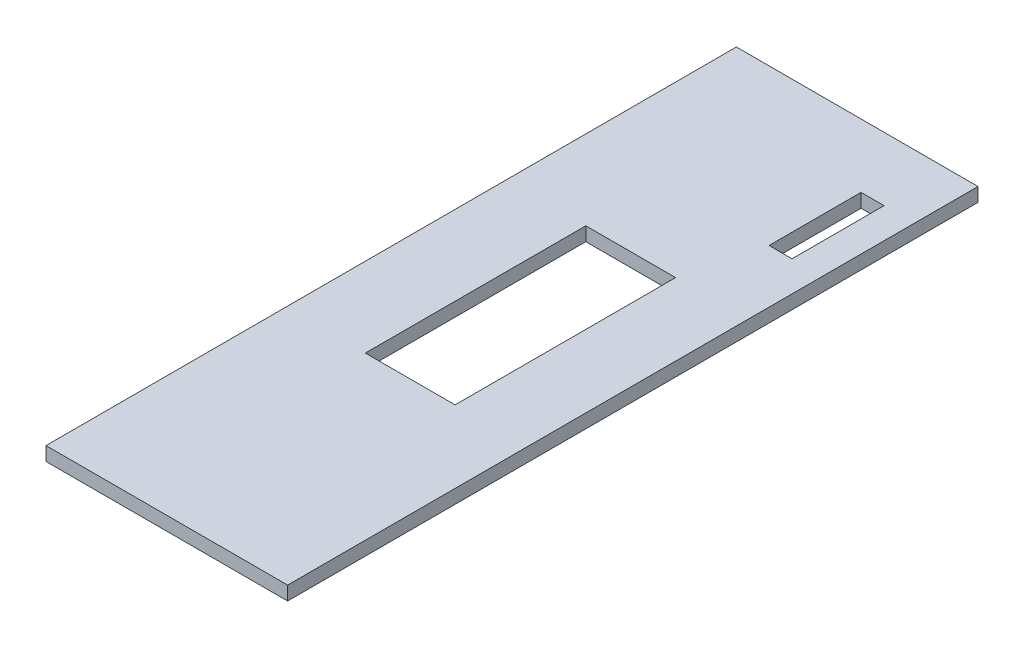
ISO-10303-21;
HEADER;
FILE_DESCRIPTION(('STEP AP214'),'2;1');
FILE_NAME('part.step','',(''),(''),'','','');
FILE_SCHEMA(('AUTOMOTIVE_DESIGN { 1 0 10303 214 1 1 1 1 }'));
ENDSEC;
DATA;
#1=APPLICATION_CONTEXT('core data for automotive mechanical design processes');
#2=APPLICATION_PROTOCOL_DEFINITION('international standard','automotive_design',2000,#1);
#3=PRODUCT_CONTEXT('',#1,'mechanical');
#4=PRODUCT('Part','Part','',(#3));
#5=PRODUCT_RELATED_PRODUCT_CATEGORY('part','',(#4));
#6=PRODUCT_DEFINITION_FORMATION('','',#4);
#7=PRODUCT_DEFINITION_CONTEXT('part definition',#1,'design');
#8=PRODUCT_DEFINITION('design','',#6,#7);
#9=PRODUCT_DEFINITION_SHAPE('','',#8);
#10=(LENGTH_UNIT() NAMED_UNIT(*) SI_UNIT(.MILLI.,.METRE.));
#11=(NAMED_UNIT(*) PLANE_ANGLE_UNIT() SI_UNIT($,.RADIAN.));
#12=(NAMED_UNIT(*) SI_UNIT($,.STERADIAN.) SOLID_ANGLE_UNIT());
#13=UNCERTAINTY_MEASURE_WITH_UNIT(LENGTH_MEASURE(1.E-05),#10,'distance_accuracy_value','');
#14=(GEOMETRIC_REPRESENTATION_CONTEXT(3) GLOBAL_UNCERTAINTY_ASSIGNED_CONTEXT((#13)) GLOBAL_UNIT_ASSIGNED_CONTEXT((#10,
#11,#12)) REPRESENTATION_CONTEXT('',''));
#15=CARTESIAN_POINT('',(0.,0.,0.));
#16=DIRECTION('',(0.,0.,1.));
#17=DIRECTION('',(1.,0.,0.));
#18=AXIS2_PLACEMENT_3D('',#15,#16,#17);
#19=CARTESIAN_POINT('',(-30.1902748414376,8.76849894291755,300.));
#20=DIRECTION('',(1.,0.,0.));
#21=DIRECTION('',(0.,0.,-1.));
#22=AXIS2_PLACEMENT_3D('',#19,#20,#21);
#23=PLANE('',#22);
#24=DIRECTION('',(0.,-1.,0.));
#25=VECTOR('',#24,1.);
#26=CARTESIAN_POINT('',(-30.1902748414376,8.76849894291755,0.));
#27=LINE('',#26,#25);
#28=CARTESIAN_POINT('',(-30.1902748414376,8.76849894291755,0.));
#29=VERTEX_POINT('',#28);
#30=CARTESIAN_POINT('',(-30.1902748414376,2.76849894291755,0.));
#31=VERTEX_POINT('',#30);
#32=EDGE_CURVE('E190',#29,#31,#27,.T.);
#33=ORIENTED_EDGE('',*,*,#32,.T.);
#34=DIRECTION('',(0.,0.,-1.));
#35=VECTOR('',#34,1.);
#36=CARTESIAN_POINT('',(-30.1902748414376,2.76849894291755,300.));
#37=LINE('',#36,#35);
#38=CARTESIAN_POINT('',(-30.1902748414376,2.76849894291755,300.));
#39=VERTEX_POINT('',#38);
#40=EDGE_CURVE('E11',#39,#31,#37,.T.);
#41=ORIENTED_EDGE('',*,*,#40,.F.);
#42=DIRECTION('',(0.,-1.,0.));
#43=VECTOR('',#42,1.);
#44=CARTESIAN_POINT('',(-30.1902748414376,8.76849894291755,300.));
#45=LINE('',#44,#43);
#46=CARTESIAN_POINT('',(-30.1902748414376,8.76849894291755,300.));
#47=VERTEX_POINT('',#46);
#48=EDGE_CURVE('E191',#47,#39,#45,.T.);
#49=ORIENTED_EDGE('',*,*,#48,.F.);
#50=DIRECTION('',(0.,0.,-1.));
#51=VECTOR('',#50,1.);
#52=CARTESIAN_POINT('',(-30.1902748414376,8.76849894291755,300.));
#53=LINE('',#52,#51);
#54=EDGE_CURVE('E201',#47,#29,#53,.T.);
#55=ORIENTED_EDGE('',*,*,#54,.T.);
#56=EDGE_LOOP('',(#33,#41,#49,#55));
#57=FACE_BOUND('',#56,.T.);
#58=ADVANCED_FACE('F33',(#57),#23,.F.);
#59=CARTESIAN_POINT('',(-30.1902748414376,2.76849894291755,300.));
#60=DIRECTION('',(0.,1.,0.));
#61=DIRECTION('',(0.,0.,1.));
#62=AXIS2_PLACEMENT_3D('',#59,#60,#61);
#63=PLANE('',#62);
#64=DIRECTION('',(-1.,0.,0.));
#65=VECTOR('',#64,1.);
#66=CARTESIAN_POINT('',(-30.1902748414376,2.76849894291755,100.));
#67=LINE('',#66,#65);
#68=CARTESIAN_POINT('',(43.3797251585624,2.76849894291755,100.));
#69=VERTEX_POINT('',#68);
#70=CARTESIAN_POINT('',(4.37972515856238,2.76849894291755,100.));
#71=VERTEX_POINT('',#70);
#72=EDGE_CURVE('E152',#69,#71,#67,.T.);
#73=ORIENTED_EDGE('',*,*,#72,.T.);
#74=DIRECTION('',(0.,0.,1.));
#75=VECTOR('',#74,1.);
#76=CARTESIAN_POINT('',(4.37972515856241,2.76849894291755,300.));
#77=LINE('',#76,#75);
#78=CARTESIAN_POINT('',(4.37972515856239,2.76849894291755,195.8));
#79=VERTEX_POINT('',#78);
#80=EDGE_CURVE('E155',#71,#79,#77,.T.);
#81=ORIENTED_EDGE('',*,*,#80,.T.);
#82=DIRECTION('',(1.,0.,0.));
#83=VECTOR('',#82,1.);
#84=CARTESIAN_POINT('',(-30.1902748414376,2.76849894291755,195.8));
#85=LINE('',#84,#83);
#86=CARTESIAN_POINT('',(43.3797251585624,2.76849894291755,195.8));
#87=VERTEX_POINT('',#86);
#88=EDGE_CURVE('E147',#79,#87,#85,.T.);
#89=ORIENTED_EDGE('',*,*,#88,.T.);
#90=DIRECTION('',(0.,0.,-1.));
#91=VECTOR('',#90,1.);
#92=CARTESIAN_POINT('',(43.3797251585624,2.76849894291755,300.));
#93=LINE('',#92,#91);
#94=EDGE_CURVE('E127',#87,#69,#93,.T.);
#95=ORIENTED_EDGE('',*,*,#94,.T.);
#96=EDGE_LOOP('',(#73,#81,#89,#95));
#97=FACE_BOUND('',#96,.T.);
#98=DIRECTION('',(-1.,0.,0.));
#99=VECTOR('',#98,1.);
#100=CARTESIAN_POINT('',(-30.1902748414376,2.76849894291755,27.62));
#101=LINE('',#100,#99);
#102=CARTESIAN_POINT('',(61.6097251585624,2.76849894291755,27.62));
#103=VERTEX_POINT('',#102);
#104=CARTESIAN_POINT('',(51.6097251585624,2.76849894291755,27.62));
#105=VERTEX_POINT('',#104);
#106=EDGE_CURVE('E184',#103,#105,#101,.T.);
#107=ORIENTED_EDGE('',*,*,#106,.T.);
#108=DIRECTION('',(0.,0.,1.));
#109=VECTOR('',#108,1.);
#110=CARTESIAN_POINT('',(51.6097251585624,2.76849894291755,300.));
#111=LINE('',#110,#109);
#112=CARTESIAN_POINT('',(51.6097251585624,2.76849894291755,67.62));
#113=VERTEX_POINT('',#112);
#114=EDGE_CURVE('E187',#105,#113,#111,.T.);
#115=ORIENTED_EDGE('',*,*,#114,.T.);
#116=DIRECTION('',(1.,0.,0.));
#117=VECTOR('',#116,1.);
#118=CARTESIAN_POINT('',(-30.1902748414376,2.76849894291755,67.62));
#119=LINE('',#118,#117);
#120=CARTESIAN_POINT('',(61.6097251585624,2.76849894291755,67.62));
#121=VERTEX_POINT('',#120);
#122=EDGE_CURVE('E172',#113,#121,#119,.T.);
#123=ORIENTED_EDGE('',*,*,#122,.T.);
#124=DIRECTION('',(0.,0.,-1.));
#125=VECTOR('',#124,1.);
#126=CARTESIAN_POINT('',(61.6097251585624,2.76849894291755,300.));
#127=LINE('',#126,#125);
#128=EDGE_CURVE('E181',#121,#103,#127,.T.);
#129=ORIENTED_EDGE('',*,*,#128,.T.);
#130=EDGE_LOOP('',(#107,#115,#123,#129));
#131=FACE_BOUND('',#130,.T.);
#132=DIRECTION('',(1.,0.,0.));
#133=VECTOR('',#132,1.);
#134=CARTESIAN_POINT('',(-30.1902748414376,2.76849894291755,0.));
#135=LINE('',#134,#133);
#136=CARTESIAN_POINT('',(74.8097251585624,2.76849894291755,0.));
#137=VERTEX_POINT('',#136);
#138=EDGE_CURVE('E204',#31,#137,#135,.T.);
#139=ORIENTED_EDGE('',*,*,#138,.T.);
#140=DIRECTION('',(0.,0.,-1.));
#141=VECTOR('',#140,1.);
#142=CARTESIAN_POINT('',(74.8097251585624,2.76849894291755,300.));
#143=LINE('',#142,#141);
#144=CARTESIAN_POINT('',(74.8097251585624,2.76849894291755,300.));
#145=VERTEX_POINT('',#144);
#146=EDGE_CURVE('E40',#145,#137,#143,.T.);
#147=ORIENTED_EDGE('',*,*,#146,.F.);
#148=DIRECTION('',(1.,0.,0.));
#149=VECTOR('',#148,1.);
#150=CARTESIAN_POINT('',(-30.1902748414376,2.76849894291755,300.));
#151=LINE('',#150,#149);
#152=EDGE_CURVE('E194',#39,#145,#151,.T.);
#153=ORIENTED_EDGE('',*,*,#152,.F.);
#154=ORIENTED_EDGE('',*,*,#40,.T.);
#155=EDGE_LOOP('',(#139,#147,#153,#154));
#156=FACE_BOUND('',#155,.T.);
#157=ADVANCED_FACE('F233',(#97,#131,#156),#63,.F.);
#158=CARTESIAN_POINT('',(74.8097251585624,8.76849894291755,300.));
#159=DIRECTION('',(-1.,0.,0.));
#160=DIRECTION('',(0.,0.,1.));
#161=AXIS2_PLACEMENT_3D('',#158,#159,#160);
#162=PLANE('',#161);
#163=DIRECTION('',(0.,1.,0.));
#164=VECTOR('',#163,1.);
#165=CARTESIAN_POINT('',(74.8097251585624,8.76849894291755,0.));
#166=LINE('',#165,#164);
#167=CARTESIAN_POINT('',(74.8097251585624,8.76849894291755,0.));
#168=VERTEX_POINT('',#167);
#169=EDGE_CURVE('E206',#137,#168,#166,.T.);
#170=ORIENTED_EDGE('',*,*,#169,.T.);
#171=DIRECTION('',(0.,0.,-1.));
#172=VECTOR('',#171,1.);
#173=CARTESIAN_POINT('',(74.8097251585624,8.76849894291755,300.));
#174=LINE('',#173,#172);
#175=CARTESIAN_POINT('',(74.8097251585624,8.76849894291755,300.));
#176=VERTEX_POINT('',#175);
#177=EDGE_CURVE('E211',#176,#168,#174,.T.);
#178=ORIENTED_EDGE('',*,*,#177,.F.);
#179=DIRECTION('',(0.,1.,0.));
#180=VECTOR('',#179,1.);
#181=CARTESIAN_POINT('',(74.8097251585624,8.76849894291755,300.));
#182=LINE('',#181,#180);
#183=EDGE_CURVE('E197',#145,#176,#182,.T.);
#184=ORIENTED_EDGE('',*,*,#183,.F.);
#185=ORIENTED_EDGE('',*,*,#146,.T.);
#186=EDGE_LOOP('',(#170,#178,#184,#185));
#187=FACE_BOUND('',#186,.T.);
#188=ADVANCED_FACE('F218',(#187),#162,.F.);
#189=CARTESIAN_POINT('',(-30.1902748414376,8.76849894291755,300.));
#190=DIRECTION('',(0.,-1.,0.));
#191=DIRECTION('',(0.,0.,-1.));
#192=AXIS2_PLACEMENT_3D('',#189,#190,#191);
#193=PLANE('',#192);
#194=DIRECTION('',(1.,0.,0.));
#195=VECTOR('',#194,1.);
#196=CARTESIAN_POINT('',(4.37972515856239,8.76849894291755,195.8));
#197=LINE('',#196,#195);
#198=CARTESIAN_POINT('',(4.37972515856239,8.76849894291755,195.8));
#199=VERTEX_POINT('',#198);
#200=CARTESIAN_POINT('',(43.3797251585624,8.76849894291755,195.8));
#201=VERTEX_POINT('',#200);
#202=EDGE_CURVE('E133',#199,#201,#197,.T.);
#203=ORIENTED_EDGE('',*,*,#202,.F.);
#204=DIRECTION('',(0.,0.,1.));
#205=VECTOR('',#204,1.);
#206=CARTESIAN_POINT('',(4.37972515856238,8.76849894291755,100.));
#207=LINE('',#206,#205);
#208=CARTESIAN_POINT('',(4.37972515856238,8.76849894291755,100.));
#209=VERTEX_POINT('',#208);
#210=EDGE_CURVE('E55',#209,#199,#207,.T.);
#211=ORIENTED_EDGE('',*,*,#210,.F.);
#212=DIRECTION('',(-1.,0.,0.));
#213=VECTOR('',#212,1.);
#214=CARTESIAN_POINT('',(4.37972515856238,8.76849894291755,100.));
#215=LINE('',#214,#213);
#216=CARTESIAN_POINT('',(43.3797251585624,8.76849894291755,100.));
#217=VERTEX_POINT('',#216);
#218=EDGE_CURVE('E140',#217,#209,#215,.T.);
#219=ORIENTED_EDGE('',*,*,#218,.F.);
#220=DIRECTION('',(0.,0.,-1.));
#221=VECTOR('',#220,1.);
#222=CARTESIAN_POINT('',(43.3797251585624,8.76849894291755,100.));
#223=LINE('',#222,#221);
#224=EDGE_CURVE('E124',#201,#217,#223,.T.);
#225=ORIENTED_EDGE('',*,*,#224,.F.);
#226=EDGE_LOOP('',(#203,#211,#219,#225));
#227=FACE_BOUND('',#226,.T.);
#228=DIRECTION('',(1.,0.,0.));
#229=VECTOR('',#228,1.);
#230=CARTESIAN_POINT('',(51.6097251585624,8.76849894291755,67.62));
#231=LINE('',#230,#229);
#232=CARTESIAN_POINT('',(51.6097251585624,8.76849894291755,67.62));
#233=VERTEX_POINT('',#232);
#234=CARTESIAN_POINT('',(61.6097251585624,8.76849894291755,67.62));
#235=VERTEX_POINT('',#234);
#236=EDGE_CURVE('E160',#233,#235,#231,.T.);
#237=ORIENTED_EDGE('',*,*,#236,.F.);
#238=DIRECTION('',(0.,0.,1.));
#239=VECTOR('',#238,1.);
#240=CARTESIAN_POINT('',(51.6097251585624,8.76849894291755,27.62));
#241=LINE('',#240,#239);
#242=CARTESIAN_POINT('',(51.6097251585624,8.76849894291755,27.62));
#243=VERTEX_POINT('',#242);
#244=EDGE_CURVE('E158',#243,#233,#241,.T.);
#245=ORIENTED_EDGE('',*,*,#244,.F.);
#246=DIRECTION('',(-1.,0.,0.));
#247=VECTOR('',#246,1.);
#248=CARTESIAN_POINT('',(51.6097251585624,8.76849894291755,27.62));
#249=LINE('',#248,#247);
#250=CARTESIAN_POINT('',(61.6097251585624,8.76849894291755,27.62));
#251=VERTEX_POINT('',#250);
#252=EDGE_CURVE('E166',#251,#243,#249,.T.);
#253=ORIENTED_EDGE('',*,*,#252,.F.);
#254=DIRECTION('',(0.,0.,-1.));
#255=VECTOR('',#254,1.);
#256=CARTESIAN_POINT('',(61.6097251585624,8.76849894291755,27.62));
#257=LINE('',#256,#255);
#258=EDGE_CURVE('E163',#235,#251,#257,.T.);
#259=ORIENTED_EDGE('',*,*,#258,.F.);
#260=EDGE_LOOP('',(#237,#245,#253,#259));
#261=FACE_BOUND('',#260,.T.);
#262=DIRECTION('',(-1.,0.,0.));
#263=VECTOR('',#262,1.);
#264=CARTESIAN_POINT('',(-30.1902748414376,8.76849894291755,0.));
#265=LINE('',#264,#263);
#266=EDGE_CURVE('E195',#168,#29,#265,.T.);
#267=ORIENTED_EDGE('',*,*,#266,.T.);
#268=ORIENTED_EDGE('',*,*,#54,.F.);
#269=DIRECTION('',(-1.,0.,0.));
#270=VECTOR('',#269,1.);
#271=CARTESIAN_POINT('',(-30.1902748414376,8.76849894291755,300.));
#272=LINE('',#271,#270);
#273=EDGE_CURVE('E199',#176,#47,#272,.T.);
#274=ORIENTED_EDGE('',*,*,#273,.F.);
#275=ORIENTED_EDGE('',*,*,#177,.T.);
#276=EDGE_LOOP('',(#267,#268,#274,#275));
#277=FACE_BOUND('',#276,.T.);
#278=ADVANCED_FACE('F137',(#227,#261,#277),#193,.F.);
#279=CARTESIAN_POINT('',(0.,0.,300.));
#280=DIRECTION('',(0.,0.,1.));
#281=DIRECTION('',(1.,0.,0.));
#282=AXIS2_PLACEMENT_3D('',#279,#280,#281);
#283=PLANE('',#282);
#284=ORIENTED_EDGE('',*,*,#48,.T.);
#285=ORIENTED_EDGE('',*,*,#152,.T.);
#286=ORIENTED_EDGE('',*,*,#183,.T.);
#287=ORIENTED_EDGE('',*,*,#273,.T.);
#288=EDGE_LOOP('',(#284,#285,#286,#287));
#289=FACE_BOUND('',#288,.T.);
#290=ADVANCED_FACE('F232',(#289),#283,.T.);
#291=CARTESIAN_POINT('',(0.,0.,0.));
#292=DIRECTION('',(0.,0.,1.));
#293=DIRECTION('',(1.,0.,0.));
#294=AXIS2_PLACEMENT_3D('',#291,#292,#293);
#295=PLANE('',#294);
#296=ORIENTED_EDGE('',*,*,#32,.F.);
#297=ORIENTED_EDGE('',*,*,#266,.F.);
#298=ORIENTED_EDGE('',*,*,#169,.F.);
#299=ORIENTED_EDGE('',*,*,#138,.F.);
#300=EDGE_LOOP('',(#296,#297,#298,#299));
#301=FACE_BOUND('',#300,.T.);
#302=ADVANCED_FACE('F224',(#301),#295,.F.);
#303=CARTESIAN_POINT('',(51.6097251585624,-1.23150105708245,27.62));
#304=DIRECTION('',(-1.,0.,0.));
#305=DIRECTION('',(0.,0.,1.));
#306=AXIS2_PLACEMENT_3D('',#303,#304,#305);
#307=PLANE('',#306);
#308=DIRECTION('',(0.,1.,0.));
#309=VECTOR('',#308,1.);
#310=CARTESIAN_POINT('',(51.6097251585624,-1.23150105708245,27.62));
#311=LINE('',#310,#309);
#312=EDGE_CURVE('E170',#105,#243,#311,.T.);
#313=ORIENTED_EDGE('',*,*,#312,.T.);
#314=ORIENTED_EDGE('',*,*,#244,.T.);
#315=DIRECTION('',(0.,1.,0.));
#316=VECTOR('',#315,1.);
#317=CARTESIAN_POINT('',(51.6097251585624,-1.23150105708245,67.62));
#318=LINE('',#317,#316);
#319=EDGE_CURVE('E169',#113,#233,#318,.T.);
#320=ORIENTED_EDGE('',*,*,#319,.F.);
#321=ORIENTED_EDGE('',*,*,#114,.F.);
#322=EDGE_LOOP('',(#313,#314,#320,#321));
#323=FACE_BOUND('',#322,.T.);
#324=ADVANCED_FACE('F247',(#323),#307,.F.);
#325=CARTESIAN_POINT('',(51.6097251585624,-1.23150105708245,27.62));
#326=DIRECTION('',(0.,0.,-1.));
#327=DIRECTION('',(-1.,0.,0.));
#328=AXIS2_PLACEMENT_3D('',#325,#326,#327);
#329=PLANE('',#328);
#330=DIRECTION('',(0.,1.,0.));
#331=VECTOR('',#330,1.);
#332=CARTESIAN_POINT('',(61.6097251585624,-1.23150105708245,27.62));
#333=LINE('',#332,#331);
#334=EDGE_CURVE('E173',#103,#251,#333,.T.);
#335=ORIENTED_EDGE('',*,*,#334,.T.);
#336=ORIENTED_EDGE('',*,*,#252,.T.);
#337=ORIENTED_EDGE('',*,*,#312,.F.);
#338=ORIENTED_EDGE('',*,*,#106,.F.);
#339=EDGE_LOOP('',(#335,#336,#337,#338));
#340=FACE_BOUND('',#339,.T.);
#341=ADVANCED_FACE('F252',(#340),#329,.F.);
#342=CARTESIAN_POINT('',(61.6097251585624,-1.23150105708245,27.62));
#343=DIRECTION('',(1.,0.,0.));
#344=DIRECTION('',(0.,0.,-1.));
#345=AXIS2_PLACEMENT_3D('',#342,#343,#344);
#346=PLANE('',#345);
#347=DIRECTION('',(0.,1.,0.));
#348=VECTOR('',#347,1.);
#349=CARTESIAN_POINT('',(61.6097251585624,-1.23150105708245,67.62));
#350=LINE('',#349,#348);
#351=EDGE_CURVE('E175',#121,#235,#350,.T.);
#352=ORIENTED_EDGE('',*,*,#351,.T.);
#353=ORIENTED_EDGE('',*,*,#258,.T.);
#354=ORIENTED_EDGE('',*,*,#334,.F.);
#355=ORIENTED_EDGE('',*,*,#128,.F.);
#356=EDGE_LOOP('',(#352,#353,#354,#355));
#357=FACE_BOUND('',#356,.T.);
#358=ADVANCED_FACE('F258',(#357),#346,.F.);
#359=CARTESIAN_POINT('',(51.6097251585624,-1.23150105708245,67.62));
#360=DIRECTION('',(0.,0.,1.));
#361=DIRECTION('',(1.,0.,0.));
#362=AXIS2_PLACEMENT_3D('',#359,#360,#361);
#363=PLANE('',#362);
#364=ORIENTED_EDGE('',*,*,#319,.T.);
#365=ORIENTED_EDGE('',*,*,#236,.T.);
#366=ORIENTED_EDGE('',*,*,#351,.F.);
#367=ORIENTED_EDGE('',*,*,#122,.F.);
#368=EDGE_LOOP('',(#364,#365,#366,#367));
#369=FACE_BOUND('',#368,.T.);
#370=ADVANCED_FACE('F254',(#369),#363,.F.);
#371=CARTESIAN_POINT('',(4.37972515856238,-1.23150105708245,100.));
#372=DIRECTION('',(-1.,0.,0.));
#373=DIRECTION('',(0.,0.,1.));
#374=AXIS2_PLACEMENT_3D('',#371,#372,#373);
#375=PLANE('',#374);
#376=DIRECTION('',(0.,1.,0.));
#377=VECTOR('',#376,1.);
#378=CARTESIAN_POINT('',(4.37972515856238,-1.23150105708245,100.));
#379=LINE('',#378,#377);
#380=EDGE_CURVE('E145',#71,#209,#379,.T.);
#381=ORIENTED_EDGE('',*,*,#380,.T.);
#382=ORIENTED_EDGE('',*,*,#210,.T.);
#383=DIRECTION('',(0.,1.,0.));
#384=VECTOR('',#383,1.);
#385=CARTESIAN_POINT('',(4.37972515856239,-1.23150105708245,195.8));
#386=LINE('',#385,#384);
#387=EDGE_CURVE('E130',#79,#199,#386,.T.);
#388=ORIENTED_EDGE('',*,*,#387,.F.);
#389=ORIENTED_EDGE('',*,*,#80,.F.);
#390=EDGE_LOOP('',(#381,#382,#388,#389));
#391=FACE_BOUND('',#390,.T.);
#392=ADVANCED_FACE('F257',(#391),#375,.F.);
#393=CARTESIAN_POINT('',(4.37972515856238,-1.23150105708245,100.));
#394=DIRECTION('',(0.,0.,-1.));
#395=DIRECTION('',(-1.,0.,0.));
#396=AXIS2_PLACEMENT_3D('',#393,#394,#395);
#397=PLANE('',#396);
#398=DIRECTION('',(0.,1.,0.));
#399=VECTOR('',#398,1.);
#400=CARTESIAN_POINT('',(43.3797251585624,-1.23150105708245,100.));
#401=LINE('',#400,#399);
#402=EDGE_CURVE('E129',#69,#217,#401,.T.);
#403=ORIENTED_EDGE('',*,*,#402,.T.);
#404=ORIENTED_EDGE('',*,*,#218,.T.);
#405=ORIENTED_EDGE('',*,*,#380,.F.);
#406=ORIENTED_EDGE('',*,*,#72,.F.);
#407=EDGE_LOOP('',(#403,#404,#405,#406));
#408=FACE_BOUND('',#407,.T.);
#409=ADVANCED_FACE('F268',(#408),#397,.F.);
#410=CARTESIAN_POINT('',(43.3797251585624,-1.23150105708245,100.));
#411=DIRECTION('',(1.,0.,0.));
#412=DIRECTION('',(0.,0.,-1.));
#413=AXIS2_PLACEMENT_3D('',#410,#411,#412);
#414=PLANE('',#413);
#415=DIRECTION('',(0.,1.,0.));
#416=VECTOR('',#415,1.);
#417=CARTESIAN_POINT('',(43.3797251585624,-1.23150105708245,195.8));
#418=LINE('',#417,#416);
#419=EDGE_CURVE('E47',#87,#201,#418,.T.);
#420=ORIENTED_EDGE('',*,*,#419,.T.);
#421=ORIENTED_EDGE('',*,*,#224,.T.);
#422=ORIENTED_EDGE('',*,*,#402,.F.);
#423=ORIENTED_EDGE('',*,*,#94,.F.);
#424=EDGE_LOOP('',(#420,#421,#422,#423));
#425=FACE_BOUND('',#424,.T.);
#426=ADVANCED_FACE('F121',(#425),#414,.F.);
#427=CARTESIAN_POINT('',(4.37972515856239,-1.23150105708245,195.8));
#428=DIRECTION('',(0.,0.,1.));
#429=DIRECTION('',(1.,0.,0.));
#430=AXIS2_PLACEMENT_3D('',#427,#428,#429);
#431=PLANE('',#430);
#432=ORIENTED_EDGE('',*,*,#387,.T.);
#433=ORIENTED_EDGE('',*,*,#202,.T.);
#434=ORIENTED_EDGE('',*,*,#419,.F.);
#435=ORIENTED_EDGE('',*,*,#88,.F.);
#436=EDGE_LOOP('',(#432,#433,#434,#435));
#437=FACE_BOUND('',#436,.T.);
#438=ADVANCED_FACE('F134',(#437),#431,.F.);
#439=CLOSED_SHELL('',(#58,#157,#188,#278,#290,#302,#324,#341,#358,#370,#392,#409,#426,#438));
#440=MANIFOLD_SOLID_BREP('B2',#439);
#441=ADVANCED_BREP_SHAPE_REPRESENTATION('',(#18,#440),#14);
#442=SHAPE_DEFINITION_REPRESENTATION(#9,#441);
ENDSEC;
END-ISO-10303-21;
